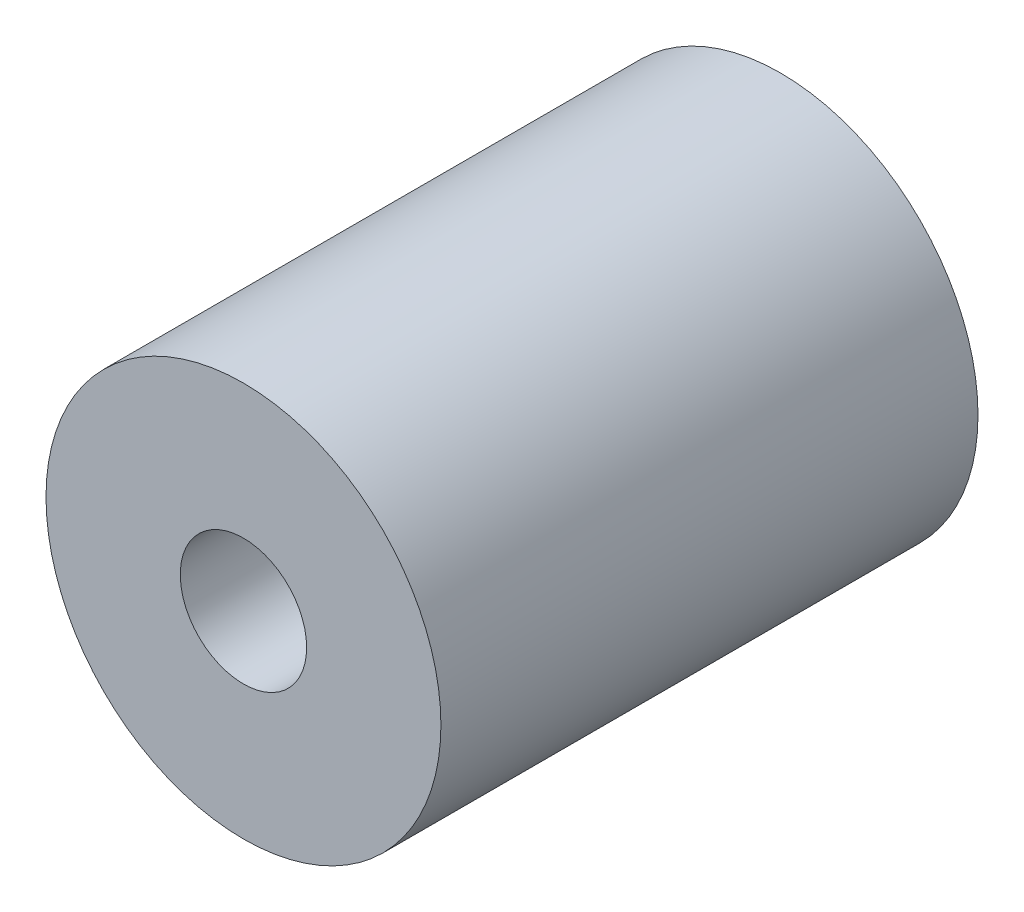
ISO-10303-21;
HEADER;
FILE_DESCRIPTION(('STEP AP214'),'2;1');
FILE_NAME('part.step','',(''),(''),'','','');
FILE_SCHEMA(('AUTOMOTIVE_DESIGN { 1 0 10303 214 1 1 1 1 }'));
ENDSEC;
DATA;
#1=APPLICATION_CONTEXT('core data for automotive mechanical design processes');
#2=APPLICATION_PROTOCOL_DEFINITION('international standard','automotive_design',2000,#1);
#3=PRODUCT_CONTEXT('',#1,'mechanical');
#4=PRODUCT('Part','Part','',(#3));
#5=PRODUCT_RELATED_PRODUCT_CATEGORY('part','',(#4));
#6=PRODUCT_DEFINITION_FORMATION('','',#4);
#7=PRODUCT_DEFINITION_CONTEXT('part definition',#1,'design');
#8=PRODUCT_DEFINITION('design','',#6,#7);
#9=PRODUCT_DEFINITION_SHAPE('','',#8);
#10=(LENGTH_UNIT() NAMED_UNIT(*) SI_UNIT(.MILLI.,.METRE.));
#11=(NAMED_UNIT(*) PLANE_ANGLE_UNIT() SI_UNIT($,.RADIAN.));
#12=(NAMED_UNIT(*) SI_UNIT($,.STERADIAN.) SOLID_ANGLE_UNIT());
#13=UNCERTAINTY_MEASURE_WITH_UNIT(LENGTH_MEASURE(1.E-05),#10,'distance_accuracy_value','');
#14=(GEOMETRIC_REPRESENTATION_CONTEXT(3) GLOBAL_UNCERTAINTY_ASSIGNED_CONTEXT((#13)) GLOBAL_UNIT_ASSIGNED_CONTEXT((#10,
#11,#12)) REPRESENTATION_CONTEXT('',''));
#15=CARTESIAN_POINT('',(0.,0.,0.));
#16=DIRECTION('',(0.,0.,1.));
#17=DIRECTION('',(1.,0.,0.));
#18=AXIS2_PLACEMENT_3D('',#15,#16,#17);
#19=CARTESIAN_POINT('',(0.,0.,34.));
#20=DIRECTION('',(0.,0.,-1.));
#21=DIRECTION('',(-1.,0.,0.));
#22=AXIS2_PLACEMENT_3D('',#19,#20,#21);
#23=CYLINDRICAL_SURFACE('',#22,12.5);
#24=CARTESIAN_POINT('',(0.,0.,34.));
#25=DIRECTION('',(0.,0.,1.));
#26=DIRECTION('',(1.,0.,0.));
#27=AXIS2_PLACEMENT_3D('',#24,#25,#26);
#28=CIRCLE('',#27,12.5);
#29=CARTESIAN_POINT('',(12.5,0.,34.));
#30=VERTEX_POINT('',#29);
#31=EDGE_CURVE('E10',#30,#30,#28,.T.);
#32=ORIENTED_EDGE('',*,*,#31,.F.);
#33=EDGE_LOOP('',(#32));
#34=FACE_BOUND('',#33,.T.);
#35=CARTESIAN_POINT('',(0.,0.,0.));
#36=DIRECTION('',(0.,0.,1.));
#37=DIRECTION('',(1.,0.,0.));
#38=AXIS2_PLACEMENT_3D('',#35,#36,#37);
#39=CIRCLE('',#38,12.5);
#40=CARTESIAN_POINT('',(12.5,0.,0.));
#41=VERTEX_POINT('',#40);
#42=EDGE_CURVE('E34',#41,#41,#39,.T.);
#43=ORIENTED_EDGE('',*,*,#42,.T.);
#44=EDGE_LOOP('',(#43));
#45=FACE_BOUND('',#44,.T.);
#46=ADVANCED_FACE('F31',(#34,#45),#23,.T.);
#47=CARTESIAN_POINT('',(0.,0.,34.));
#48=DIRECTION('',(0.,0.,1.));
#49=DIRECTION('',(1.,0.,0.));
#50=AXIS2_PLACEMENT_3D('',#47,#48,#49);
#51=PLANE('',#50);
#52=CARTESIAN_POINT('',(0.,0.,34.));
#53=DIRECTION('',(0.,0.,1.));
#54=DIRECTION('',(1.,0.,0.));
#55=AXIS2_PLACEMENT_3D('',#52,#53,#54);
#56=CIRCLE('',#55,4.);
#57=CARTESIAN_POINT('',(4.,0.,34.));
#58=VERTEX_POINT('',#57);
#59=EDGE_CURVE('E43',#58,#58,#56,.T.);
#60=ORIENTED_EDGE('',*,*,#59,.F.);
#61=EDGE_LOOP('',(#60));
#62=FACE_BOUND('',#61,.T.);
#63=ORIENTED_EDGE('',*,*,#31,.T.);
#64=EDGE_LOOP('',(#63));
#65=FACE_BOUND('',#64,.T.);
#66=ADVANCED_FACE('F68',(#62,#65),#51,.T.);
#67=CARTESIAN_POINT('',(0.,0.,0.));
#68=DIRECTION('',(0.,0.,1.));
#69=DIRECTION('',(1.,0.,0.));
#70=AXIS2_PLACEMENT_3D('',#67,#68,#69);
#71=PLANE('',#70);
#72=CARTESIAN_POINT('',(0.,0.,0.));
#73=DIRECTION('',(0.,0.,-1.));
#74=DIRECTION('',(-1.,0.,0.));
#75=AXIS2_PLACEMENT_3D('',#72,#73,#74);
#76=CIRCLE('',#75,5.);
#77=CARTESIAN_POINT('',(-5.,0.,0.));
#78=VERTEX_POINT('',#77);
#79=EDGE_CURVE('E49',#78,#78,#76,.T.);
#80=ORIENTED_EDGE('',*,*,#79,.F.);
#81=EDGE_LOOP('',(#80));
#82=FACE_BOUND('',#81,.T.);
#83=ORIENTED_EDGE('',*,*,#42,.F.);
#84=EDGE_LOOP('',(#83));
#85=FACE_BOUND('',#84,.T.);
#86=ADVANCED_FACE('F64',(#82,#85),#71,.F.);
#87=CARTESIAN_POINT('',(0.,0.,22.));
#88=DIRECTION('',(0.,0.,1.));
#89=DIRECTION('',(1.,0.,0.));
#90=AXIS2_PLACEMENT_3D('',#87,#88,#89);
#91=CYLINDRICAL_SURFACE('',#90,4.);
#92=CARTESIAN_POINT('',(0.,0.,22.));
#93=DIRECTION('',(0.,0.,1.));
#94=DIRECTION('',(1.,0.,0.));
#95=AXIS2_PLACEMENT_3D('',#92,#93,#94);
#96=CIRCLE('',#95,4.);
#97=CARTESIAN_POINT('',(4.,0.,22.));
#98=VERTEX_POINT('',#97);
#99=EDGE_CURVE('E41',#98,#98,#96,.T.);
#100=ORIENTED_EDGE('',*,*,#99,.F.);
#101=EDGE_LOOP('',(#100));
#102=FACE_BOUND('',#101,.T.);
#103=ORIENTED_EDGE('',*,*,#59,.T.);
#104=EDGE_LOOP('',(#103));
#105=FACE_BOUND('',#104,.T.);
#106=ADVANCED_FACE('F67',(#102,#105),#91,.F.);
#107=CARTESIAN_POINT('',(0.,0.,22.));
#108=DIRECTION('',(0.,0.,1.));
#109=DIRECTION('',(1.,0.,0.));
#110=AXIS2_PLACEMENT_3D('',#107,#108,#109);
#111=PLANE('',#110);
#112=ORIENTED_EDGE('',*,*,#99,.T.);
#113=EDGE_LOOP('',(#112));
#114=FACE_BOUND('',#113,.T.);
#115=ADVANCED_FACE('F60',(#114),#111,.T.);
#116=CARTESIAN_POINT('',(0.,0.,12.));
#117=DIRECTION('',(0.,0.,-1.));
#118=DIRECTION('',(-1.,0.,0.));
#119=AXIS2_PLACEMENT_3D('',#116,#117,#118);
#120=CYLINDRICAL_SURFACE('',#119,5.);
#121=CARTESIAN_POINT('',(0.,0.,12.));
#122=DIRECTION('',(0.,0.,-1.));
#123=DIRECTION('',(-1.,0.,0.));
#124=AXIS2_PLACEMENT_3D('',#121,#122,#123);
#125=CIRCLE('',#124,5.);
#126=CARTESIAN_POINT('',(-5.,0.,12.));
#127=VERTEX_POINT('',#126);
#128=EDGE_CURVE('E46',#127,#127,#125,.T.);
#129=ORIENTED_EDGE('',*,*,#128,.F.);
#130=EDGE_LOOP('',(#129));
#131=FACE_BOUND('',#130,.T.);
#132=ORIENTED_EDGE('',*,*,#79,.T.);
#133=EDGE_LOOP('',(#132));
#134=FACE_BOUND('',#133,.T.);
#135=ADVANCED_FACE('F57',(#131,#134),#120,.F.);
#136=CARTESIAN_POINT('',(0.,0.,12.));
#137=DIRECTION('',(0.,0.,-1.));
#138=DIRECTION('',(-1.,0.,0.));
#139=AXIS2_PLACEMENT_3D('',#136,#137,#138);
#140=PLANE('',#139);
#141=ORIENTED_EDGE('',*,*,#128,.T.);
#142=EDGE_LOOP('',(#141));
#143=FACE_BOUND('',#142,.T.);
#144=ADVANCED_FACE('F55',(#143),#140,.T.);
#145=CLOSED_SHELL('',(#46,#66,#86,#106,#115,#135,#144));
#146=MANIFOLD_SOLID_BREP('B2',#145);
#147=ADVANCED_BREP_SHAPE_REPRESENTATION('',(#18,#146),#14);
#148=SHAPE_DEFINITION_REPRESENTATION(#9,#147);
ENDSEC;
END-ISO-10303-21;
